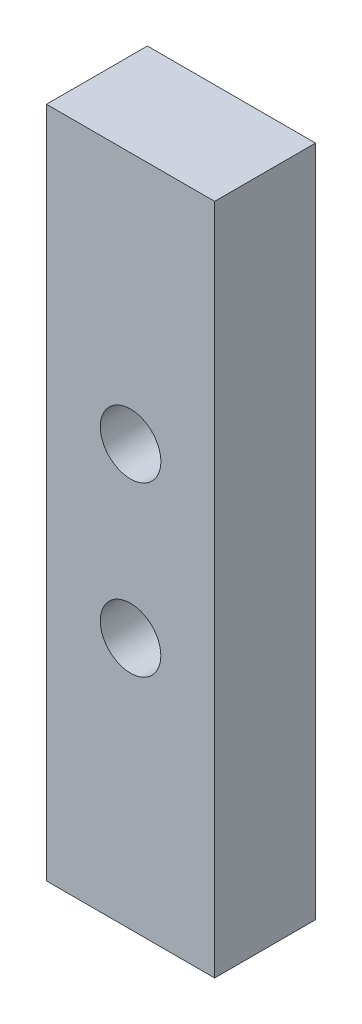
ISO-10303-21;
HEADER;
FILE_DESCRIPTION(('STEP AP214'),'2;1');
FILE_NAME('part.step','',(''),(''),'','','');
FILE_SCHEMA(('AUTOMOTIVE_DESIGN { 1 0 10303 214 1 1 1 1 }'));
ENDSEC;
DATA;
#1=APPLICATION_CONTEXT('core data for automotive mechanical design processes');
#2=APPLICATION_PROTOCOL_DEFINITION('international standard','automotive_design',2000,#1);
#3=PRODUCT_CONTEXT('',#1,'mechanical');
#4=PRODUCT('Part','Part','',(#3));
#5=PRODUCT_RELATED_PRODUCT_CATEGORY('part','',(#4));
#6=PRODUCT_DEFINITION_FORMATION('','',#4);
#7=PRODUCT_DEFINITION_CONTEXT('part definition',#1,'design');
#8=PRODUCT_DEFINITION('design','',#6,#7);
#9=PRODUCT_DEFINITION_SHAPE('','',#8);
#10=(LENGTH_UNIT() NAMED_UNIT(*) SI_UNIT(.MILLI.,.METRE.));
#11=(NAMED_UNIT(*) PLANE_ANGLE_UNIT() SI_UNIT($,.RADIAN.));
#12=(NAMED_UNIT(*) SI_UNIT($,.STERADIAN.) SOLID_ANGLE_UNIT());
#13=UNCERTAINTY_MEASURE_WITH_UNIT(LENGTH_MEASURE(1.E-05),#10,'distance_accuracy_value','');
#14=(GEOMETRIC_REPRESENTATION_CONTEXT(3) GLOBAL_UNCERTAINTY_ASSIGNED_CONTEXT((#13)) GLOBAL_UNIT_ASSIGNED_CONTEXT((#10,
#11,#12)) REPRESENTATION_CONTEXT('',''));
#15=CARTESIAN_POINT('',(0.,0.,0.));
#16=DIRECTION('',(0.,0.,1.));
#17=DIRECTION('',(1.,0.,0.));
#18=AXIS2_PLACEMENT_3D('',#15,#16,#17);
#19=CARTESIAN_POINT('',(0.,0.,3.));
#20=DIRECTION('',(0.,0.,-1.));
#21=DIRECTION('',(-1.,0.,0.));
#22=AXIS2_PLACEMENT_3D('',#19,#20,#21);
#23=PLANE('',#22);
#24=DIRECTION('',(-1.,0.,0.));
#25=VECTOR('',#24,1.);
#26=CARTESIAN_POINT('',(2.5,10.,3.));
#27=LINE('',#26,#25);
#28=CARTESIAN_POINT('',(2.5,10.,3.));
#29=VERTEX_POINT('',#28);
#30=CARTESIAN_POINT('',(-2.5,10.,3.));
#31=VERTEX_POINT('',#30);
#32=EDGE_CURVE('E98',#29,#31,#27,.T.);
#33=ORIENTED_EDGE('',*,*,#32,.T.);
#34=DIRECTION('',(0.,-1.,0.));
#35=VECTOR('',#34,1.);
#36=CARTESIAN_POINT('',(-2.5,-10.,3.));
#37=LINE('',#36,#35);
#38=CARTESIAN_POINT('',(-2.5,-10.,3.));
#39=VERTEX_POINT('',#38);
#40=EDGE_CURVE('E93',#31,#39,#37,.T.);
#41=ORIENTED_EDGE('',*,*,#40,.T.);
#42=DIRECTION('',(1.,0.,0.));
#43=VECTOR('',#42,1.);
#44=CARTESIAN_POINT('',(2.5,-10.,3.));
#45=LINE('',#44,#43);
#46=CARTESIAN_POINT('',(2.5,-10.,3.));
#47=VERTEX_POINT('',#46);
#48=EDGE_CURVE('E96',#39,#47,#45,.T.);
#49=ORIENTED_EDGE('',*,*,#48,.T.);
#50=DIRECTION('',(0.,1.,0.));
#51=VECTOR('',#50,1.);
#52=CARTESIAN_POINT('',(2.5,-10.,3.));
#53=LINE('',#52,#51);
#54=EDGE_CURVE('E63',#47,#29,#53,.T.);
#55=ORIENTED_EDGE('',*,*,#54,.T.);
#56=EDGE_LOOP('',(#33,#41,#49,#55));
#57=FACE_BOUND('',#56,.T.);
#58=CARTESIAN_POINT('',(0.,-2.5,3.));
#59=DIRECTION('',(0.,0.,1.));
#60=DIRECTION('',(1.,0.,0.));
#61=AXIS2_PLACEMENT_3D('',#58,#59,#60);
#62=CIRCLE('',#61,0.9);
#63=CARTESIAN_POINT('',(0.9,-2.5,3.));
#64=VERTEX_POINT('',#63);
#65=EDGE_CURVE('E118',#64,#64,#62,.T.);
#66=ORIENTED_EDGE('',*,*,#65,.F.);
#67=EDGE_LOOP('',(#66));
#68=FACE_BOUND('',#67,.T.);
#69=CARTESIAN_POINT('',(0.,2.5,3.));
#70=DIRECTION('',(0.,0.,1.));
#71=DIRECTION('',(-1.,0.,0.));
#72=AXIS2_PLACEMENT_3D('',#69,#70,#71);
#73=CIRCLE('',#72,0.9);
#74=CARTESIAN_POINT('',(-0.9,2.5,3.));
#75=VERTEX_POINT('',#74);
#76=EDGE_CURVE('E140',#75,#75,#73,.T.);
#77=ORIENTED_EDGE('',*,*,#76,.F.);
#78=EDGE_LOOP('',(#77));
#79=FACE_BOUND('',#78,.T.);
#80=ADVANCED_FACE('F45',(#57,#68,#79),#23,.F.);
#81=CARTESIAN_POINT('',(0.,0.,0.));
#82=DIRECTION('',(0.,0.,-1.));
#83=DIRECTION('',(-1.,0.,0.));
#84=AXIS2_PLACEMENT_3D('',#81,#82,#83);
#85=PLANE('',#84);
#86=CARTESIAN_POINT('',(0.,-2.5,0.));
#87=DIRECTION('',(0.,0.,1.));
#88=DIRECTION('',(1.,0.,0.));
#89=AXIS2_PLACEMENT_3D('',#86,#87,#88);
#90=CIRCLE('',#89,0.9);
#91=CARTESIAN_POINT('',(0.9,-2.5,0.));
#92=VERTEX_POINT('',#91);
#93=EDGE_CURVE('E136',#92,#92,#90,.T.);
#94=ORIENTED_EDGE('',*,*,#93,.T.);
#95=EDGE_LOOP('',(#94));
#96=FACE_BOUND('',#95,.T.);
#97=DIRECTION('',(-1.,0.,0.));
#98=VECTOR('',#97,1.);
#99=CARTESIAN_POINT('',(2.5,10.,0.));
#100=LINE('',#99,#98);
#101=CARTESIAN_POINT('',(2.5,10.,0.));
#102=VERTEX_POINT('',#101);
#103=CARTESIAN_POINT('',(-2.5,10.,0.));
#104=VERTEX_POINT('',#103);
#105=EDGE_CURVE('E114',#102,#104,#100,.T.);
#106=ORIENTED_EDGE('',*,*,#105,.F.);
#107=DIRECTION('',(0.,1.,0.));
#108=VECTOR('',#107,1.);
#109=CARTESIAN_POINT('',(2.5,-10.,0.));
#110=LINE('',#109,#108);
#111=CARTESIAN_POINT('',(2.5,-10.,0.));
#112=VERTEX_POINT('',#111);
#113=EDGE_CURVE('E86',#112,#102,#110,.T.);
#114=ORIENTED_EDGE('',*,*,#113,.F.);
#115=DIRECTION('',(1.,0.,0.));
#116=VECTOR('',#115,1.);
#117=CARTESIAN_POINT('',(2.5,-10.,0.));
#118=LINE('',#117,#116);
#119=CARTESIAN_POINT('',(-2.5,-10.,0.));
#120=VERTEX_POINT('',#119);
#121=EDGE_CURVE('E80',#120,#112,#118,.T.);
#122=ORIENTED_EDGE('',*,*,#121,.F.);
#123=DIRECTION('',(0.,-1.,0.));
#124=VECTOR('',#123,1.);
#125=CARTESIAN_POINT('',(-2.5,-10.,0.));
#126=LINE('',#125,#124);
#127=EDGE_CURVE('E103',#104,#120,#126,.T.);
#128=ORIENTED_EDGE('',*,*,#127,.F.);
#129=EDGE_LOOP('',(#106,#114,#122,#128));
#130=FACE_BOUND('',#129,.T.);
#131=CARTESIAN_POINT('',(0.,2.5,0.));
#132=DIRECTION('',(0.,0.,1.));
#133=DIRECTION('',(-1.,0.,0.));
#134=AXIS2_PLACEMENT_3D('',#131,#132,#133);
#135=CIRCLE('',#134,0.9);
#136=CARTESIAN_POINT('',(-0.9,2.5,0.));
#137=VERTEX_POINT('',#136);
#138=EDGE_CURVE('E144',#137,#137,#135,.T.);
#139=ORIENTED_EDGE('',*,*,#138,.T.);
#140=EDGE_LOOP('',(#139));
#141=FACE_BOUND('',#140,.T.);
#142=ADVANCED_FACE('F131',(#96,#130,#141),#85,.T.);
#143=CARTESIAN_POINT('',(2.5,10.,3.));
#144=DIRECTION('',(0.,-1.,0.));
#145=DIRECTION('',(0.,0.,-1.));
#146=AXIS2_PLACEMENT_3D('',#143,#144,#145);
#147=PLANE('',#146);
#148=ORIENTED_EDGE('',*,*,#105,.T.);
#149=DIRECTION('',(0.,0.,-1.));
#150=VECTOR('',#149,1.);
#151=CARTESIAN_POINT('',(-2.5,10.,3.));
#152=LINE('',#151,#150);
#153=EDGE_CURVE('E11',#31,#104,#152,.T.);
#154=ORIENTED_EDGE('',*,*,#153,.F.);
#155=ORIENTED_EDGE('',*,*,#32,.F.);
#156=DIRECTION('',(0.,0.,-1.));
#157=VECTOR('',#156,1.);
#158=CARTESIAN_POINT('',(2.5,10.,3.));
#159=LINE('',#158,#157);
#160=EDGE_CURVE('E110',#29,#102,#159,.T.);
#161=ORIENTED_EDGE('',*,*,#160,.T.);
#162=EDGE_LOOP('',(#148,#154,#155,#161));
#163=FACE_BOUND('',#162,.T.);
#164=ADVANCED_FACE('F47',(#163),#147,.F.);
#165=CARTESIAN_POINT('',(-2.5,-10.,3.));
#166=DIRECTION('',(1.,0.,0.));
#167=DIRECTION('',(0.,0.,-1.));
#168=AXIS2_PLACEMENT_3D('',#165,#166,#167);
#169=PLANE('',#168);
#170=ORIENTED_EDGE('',*,*,#127,.T.);
#171=DIRECTION('',(0.,0.,-1.));
#172=VECTOR('',#171,1.);
#173=CARTESIAN_POINT('',(-2.5,-10.,3.));
#174=LINE('',#173,#172);
#175=EDGE_CURVE('E55',#39,#120,#174,.T.);
#176=ORIENTED_EDGE('',*,*,#175,.F.);
#177=ORIENTED_EDGE('',*,*,#40,.F.);
#178=ORIENTED_EDGE('',*,*,#153,.T.);
#179=EDGE_LOOP('',(#170,#176,#177,#178));
#180=FACE_BOUND('',#179,.T.);
#181=ADVANCED_FACE('F102',(#180),#169,.F.);
#182=CARTESIAN_POINT('',(2.5,-10.,3.));
#183=DIRECTION('',(0.,1.,0.));
#184=DIRECTION('',(0.,0.,1.));
#185=AXIS2_PLACEMENT_3D('',#182,#183,#184);
#186=PLANE('',#185);
#187=ORIENTED_EDGE('',*,*,#121,.T.);
#188=DIRECTION('',(0.,0.,-1.));
#189=VECTOR('',#188,1.);
#190=CARTESIAN_POINT('',(2.5,-10.,3.));
#191=LINE('',#190,#189);
#192=EDGE_CURVE('E105',#47,#112,#191,.T.);
#193=ORIENTED_EDGE('',*,*,#192,.F.);
#194=ORIENTED_EDGE('',*,*,#48,.F.);
#195=ORIENTED_EDGE('',*,*,#175,.T.);
#196=EDGE_LOOP('',(#187,#193,#194,#195));
#197=FACE_BOUND('',#196,.T.);
#198=ADVANCED_FACE('F106',(#197),#186,.F.);
#199=CARTESIAN_POINT('',(2.5,-10.,3.));
#200=DIRECTION('',(-1.,0.,0.));
#201=DIRECTION('',(0.,0.,1.));
#202=AXIS2_PLACEMENT_3D('',#199,#200,#201);
#203=PLANE('',#202);
#204=ORIENTED_EDGE('',*,*,#113,.T.);
#205=ORIENTED_EDGE('',*,*,#160,.F.);
#206=ORIENTED_EDGE('',*,*,#54,.F.);
#207=ORIENTED_EDGE('',*,*,#192,.T.);
#208=EDGE_LOOP('',(#204,#205,#206,#207));
#209=FACE_BOUND('',#208,.T.);
#210=ADVANCED_FACE('F128',(#209),#203,.F.);
#211=CARTESIAN_POINT('',(0.,-2.5,3.));
#212=DIRECTION('',(0.,0.,-1.));
#213=DIRECTION('',(-1.,0.,0.));
#214=AXIS2_PLACEMENT_3D('',#211,#212,#213);
#215=CYLINDRICAL_SURFACE('',#214,0.9);
#216=ORIENTED_EDGE('',*,*,#65,.T.);
#217=EDGE_LOOP('',(#216));
#218=FACE_BOUND('',#217,.T.);
#219=ORIENTED_EDGE('',*,*,#93,.F.);
#220=EDGE_LOOP('',(#219));
#221=FACE_BOUND('',#220,.T.);
#222=ADVANCED_FACE('F163',(#218,#221),#215,.F.);
#223=CARTESIAN_POINT('',(0.,2.5,3.));
#224=DIRECTION('',(0.,0.,-1.));
#225=DIRECTION('',(-1.,0.,0.));
#226=AXIS2_PLACEMENT_3D('',#223,#224,#225);
#227=CYLINDRICAL_SURFACE('',#226,0.9);
#228=ORIENTED_EDGE('',*,*,#76,.T.);
#229=EDGE_LOOP('',(#228));
#230=FACE_BOUND('',#229,.T.);
#231=ORIENTED_EDGE('',*,*,#138,.F.);
#232=EDGE_LOOP('',(#231));
#233=FACE_BOUND('',#232,.T.);
#234=ADVANCED_FACE('F152',(#230,#233),#227,.F.);
#235=CLOSED_SHELL('',(#80,#142,#164,#181,#198,#210,#222,#234));
#236=MANIFOLD_SOLID_BREP('B2',#235);
#237=ADVANCED_BREP_SHAPE_REPRESENTATION('',(#18,#236),#14);
#238=SHAPE_DEFINITION_REPRESENTATION(#9,#237);
ENDSEC;
END-ISO-10303-21;
